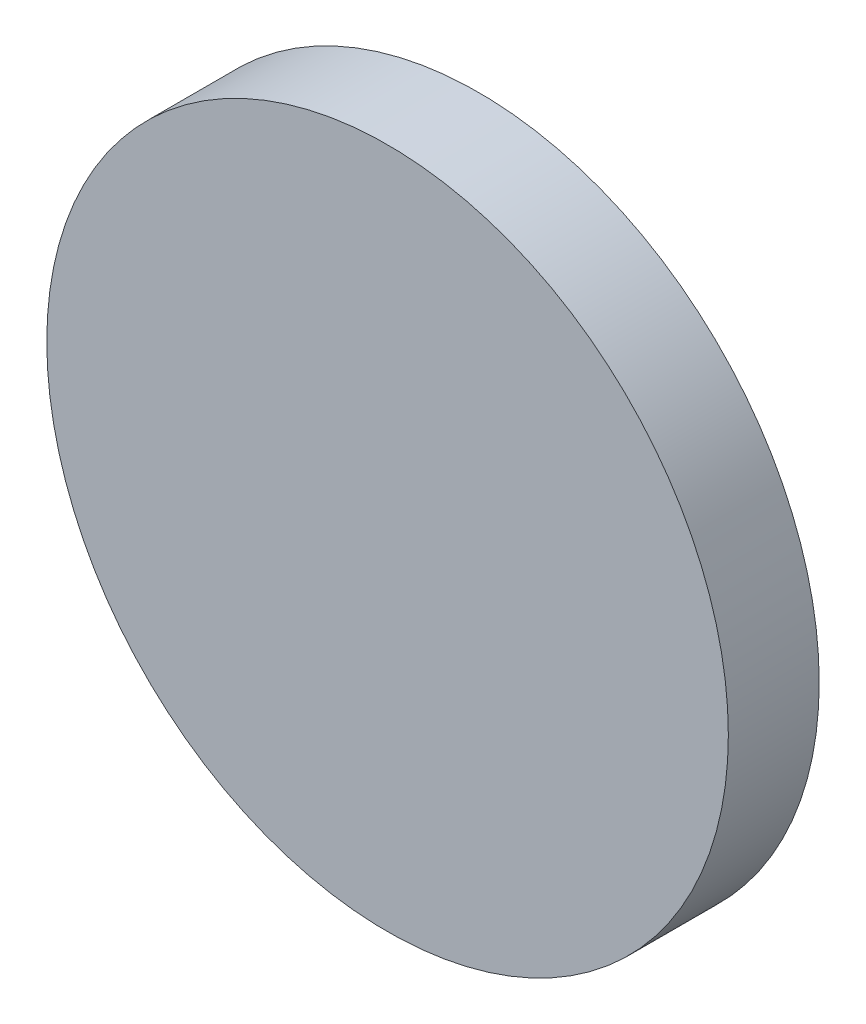
ISO-10303-21;
HEADER;
FILE_DESCRIPTION(('STEP AP214'),'2;1');
FILE_NAME('part.step','',(''),(''),'','','');
FILE_SCHEMA(('AUTOMOTIVE_DESIGN { 1 0 10303 214 1 1 1 1 }'));
ENDSEC;
DATA;
#1=APPLICATION_CONTEXT('core data for automotive mechanical design processes');
#2=APPLICATION_PROTOCOL_DEFINITION('international standard','automotive_design',2000,#1);
#3=PRODUCT_CONTEXT('',#1,'mechanical');
#4=PRODUCT('Part','Part','',(#3));
#5=PRODUCT_RELATED_PRODUCT_CATEGORY('part','',(#4));
#6=PRODUCT_DEFINITION_FORMATION('','',#4);
#7=PRODUCT_DEFINITION_CONTEXT('part definition',#1,'design');
#8=PRODUCT_DEFINITION('design','',#6,#7);
#9=PRODUCT_DEFINITION_SHAPE('','',#8);
#10=(LENGTH_UNIT() NAMED_UNIT(*) SI_UNIT(.MILLI.,.METRE.));
#11=(NAMED_UNIT(*) PLANE_ANGLE_UNIT() SI_UNIT($,.RADIAN.));
#12=(NAMED_UNIT(*) SI_UNIT($,.STERADIAN.) SOLID_ANGLE_UNIT());
#13=UNCERTAINTY_MEASURE_WITH_UNIT(LENGTH_MEASURE(1.E-05),#10,'distance_accuracy_value','');
#14=(GEOMETRIC_REPRESENTATION_CONTEXT(3) GLOBAL_UNCERTAINTY_ASSIGNED_CONTEXT((#13)) GLOBAL_UNIT_ASSIGNED_CONTEXT((#10,
#11,#12)) REPRESENTATION_CONTEXT('',''));
#15=CARTESIAN_POINT('',(0.,0.,0.));
#16=DIRECTION('',(0.,0.,1.));
#17=DIRECTION('',(1.,0.,0.));
#18=AXIS2_PLACEMENT_3D('',#15,#16,#17);
#19=CARTESIAN_POINT('',(0.,0.,1.));
#20=DIRECTION('',(0.,0.,-1.));
#21=DIRECTION('',(-1.,0.,0.));
#22=AXIS2_PLACEMENT_3D('',#19,#20,#21);
#23=CYLINDRICAL_SURFACE('',#22,3.75);
#24=CARTESIAN_POINT('',(0.,0.,1.));
#25=DIRECTION('',(0.,0.,1.));
#26=DIRECTION('',(1.,0.,0.));
#27=AXIS2_PLACEMENT_3D('',#24,#25,#26);
#28=CIRCLE('',#27,3.75);
#29=CARTESIAN_POINT('',(3.75,0.,1.));
#30=VERTEX_POINT('',#29);
#31=EDGE_CURVE('E10',#30,#30,#28,.T.);
#32=ORIENTED_EDGE('',*,*,#31,.F.);
#33=EDGE_LOOP('',(#32));
#34=FACE_BOUND('',#33,.T.);
#35=CARTESIAN_POINT('',(0.,0.,0.));
#36=DIRECTION('',(0.,0.,1.));
#37=DIRECTION('',(1.,0.,0.));
#38=AXIS2_PLACEMENT_3D('',#35,#36,#37);
#39=CIRCLE('',#38,3.75);
#40=CARTESIAN_POINT('',(3.75,0.,0.));
#41=VERTEX_POINT('',#40);
#42=EDGE_CURVE('E40',#41,#41,#39,.T.);
#43=ORIENTED_EDGE('',*,*,#42,.T.);
#44=EDGE_LOOP('',(#43));
#45=FACE_BOUND('',#44,.T.);
#46=ADVANCED_FACE('F37',(#34,#45),#23,.T.);
#47=CARTESIAN_POINT('',(0.,0.,1.));
#48=DIRECTION('',(0.,0.,1.));
#49=DIRECTION('',(1.,0.,0.));
#50=AXIS2_PLACEMENT_3D('',#47,#48,#49);
#51=PLANE('',#50);
#52=ORIENTED_EDGE('',*,*,#31,.T.);
#53=EDGE_LOOP('',(#52));
#54=FACE_BOUND('',#53,.T.);
#55=ADVANCED_FACE('F54',(#54),#51,.T.);
#56=CARTESIAN_POINT('',(0.,0.,0.));
#57=DIRECTION('',(0.,0.,1.));
#58=DIRECTION('',(1.,0.,0.));
#59=AXIS2_PLACEMENT_3D('',#56,#57,#58);
#60=PLANE('',#59);
#61=ORIENTED_EDGE('',*,*,#42,.F.);
#62=EDGE_LOOP('',(#61));
#63=FACE_BOUND('',#62,.T.);
#64=ADVANCED_FACE('F52',(#63),#60,.F.);
#65=CLOSED_SHELL('',(#46,#55,#64));
#66=MANIFOLD_SOLID_BREP('B2',#65);
#67=ADVANCED_BREP_SHAPE_REPRESENTATION('',(#18,#66),#14);
#68=SHAPE_DEFINITION_REPRESENTATION(#9,#67);
ENDSEC;
END-ISO-10303-21;
